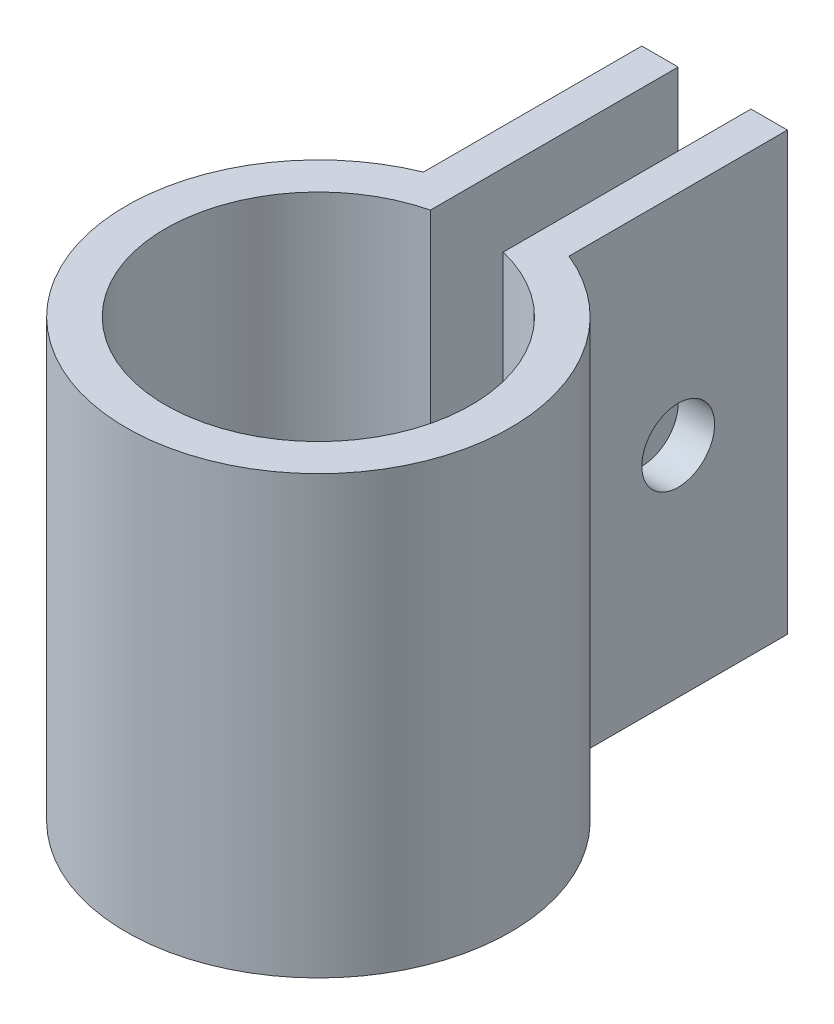
ISO-10303-21;
HEADER;
FILE_DESCRIPTION(('STEP AP214'),'2;1');
FILE_NAME('part.step','',(''),(''),'','','');
FILE_SCHEMA(('AUTOMOTIVE_DESIGN { 1 0 10303 214 1 1 1 1 }'));
ENDSEC;
DATA;
#1=APPLICATION_CONTEXT('core data for automotive mechanical design processes');
#2=APPLICATION_PROTOCOL_DEFINITION('international standard','automotive_design',2000,#1);
#3=PRODUCT_CONTEXT('',#1,'mechanical');
#4=PRODUCT('Part','Part','',(#3));
#5=PRODUCT_RELATED_PRODUCT_CATEGORY('part','',(#4));
#6=PRODUCT_DEFINITION_FORMATION('','',#4);
#7=PRODUCT_DEFINITION_CONTEXT('part definition',#1,'design');
#8=PRODUCT_DEFINITION('design','',#6,#7);
#9=PRODUCT_DEFINITION_SHAPE('','',#8);
#10=(LENGTH_UNIT() NAMED_UNIT(*) SI_UNIT(.MILLI.,.METRE.));
#11=(NAMED_UNIT(*) PLANE_ANGLE_UNIT() SI_UNIT($,.RADIAN.));
#12=(NAMED_UNIT(*) SI_UNIT($,.STERADIAN.) SOLID_ANGLE_UNIT());
#13=UNCERTAINTY_MEASURE_WITH_UNIT(LENGTH_MEASURE(1.E-05),#10,'distance_accuracy_value','');
#14=(GEOMETRIC_REPRESENTATION_CONTEXT(3) GLOBAL_UNCERTAINTY_ASSIGNED_CONTEXT((#13)) GLOBAL_UNIT_ASSIGNED_CONTEXT((#10,
#11,#12)) REPRESENTATION_CONTEXT('',''));
#15=CARTESIAN_POINT('',(0.,0.,0.));
#16=DIRECTION('',(0.,0.,1.));
#17=DIRECTION('',(1.,0.,0.));
#18=AXIS2_PLACEMENT_3D('',#15,#16,#17);
#19=CARTESIAN_POINT('',(0.,38.1,0.));
#20=DIRECTION('',(0.,-1.,0.));
#21=DIRECTION('',(0.,0.,-1.));
#22=AXIS2_PLACEMENT_3D('',#19,#20,#21);
#23=CYLINDRICAL_SURFACE('',#22,16.764);
#24=DIRECTION('',(0.,1.,0.));
#25=VECTOR('',#24,1.);
#26=CARTESIAN_POINT('',(6.35,-19.3127710336968,-15.5148057029407));
#27=LINE('',#26,#25);
#28=CARTESIAN_POINT('',(6.35,0.,-15.5148057029407));
#29=VERTEX_POINT('',#28);
#30=CARTESIAN_POINT('',(6.35,38.1,-15.5148057029407));
#31=VERTEX_POINT('',#30);
#32=EDGE_CURVE('E50',#29,#31,#27,.T.);
#33=ORIENTED_EDGE('',*,*,#32,.T.);
#34=CARTESIAN_POINT('',(0.,38.1,0.));
#35=DIRECTION('',(0.,1.,0.));
#36=DIRECTION('',(0.,0.,1.));
#37=AXIS2_PLACEMENT_3D('',#34,#35,#36);
#38=CIRCLE('',#37,16.764);
#39=CARTESIAN_POINT('',(-6.35,38.1,-15.5148057029407));
#40=VERTEX_POINT('',#39);
#41=EDGE_CURVE('E11',#40,#31,#38,.T.);
#42=ORIENTED_EDGE('',*,*,#41,.F.);
#43=DIRECTION('',(0.,1.,0.));
#44=VECTOR('',#43,1.);
#45=CARTESIAN_POINT('',(-6.35,-19.3127710336968,-15.5148057029407));
#46=LINE('',#45,#44);
#47=CARTESIAN_POINT('',(-6.35,0.,-15.5148057029407));
#48=VERTEX_POINT('',#47);
#49=EDGE_CURVE('E143',#48,#40,#46,.T.);
#50=ORIENTED_EDGE('',*,*,#49,.F.);
#51=CARTESIAN_POINT('',(0.,0.,0.));
#52=DIRECTION('',(0.,1.,0.));
#53=DIRECTION('',(0.,0.,1.));
#54=AXIS2_PLACEMENT_3D('',#51,#52,#53);
#55=CIRCLE('',#54,16.764);
#56=EDGE_CURVE('E35',#48,#29,#55,.T.);
#57=ORIENTED_EDGE('',*,*,#56,.T.);
#58=EDGE_LOOP('',(#33,#42,#50,#57));
#59=FACE_BOUND('',#58,.T.);
#60=ADVANCED_FACE('F32',(#59),#23,.T.);
#61=CARTESIAN_POINT('',(0.,38.1,0.));
#62=DIRECTION('',(0.,1.,0.));
#63=DIRECTION('',(0.,0.,1.));
#64=AXIS2_PLACEMENT_3D('',#61,#62,#63);
#65=PLANE('',#64);
#66=DIRECTION('',(1.,0.,0.));
#67=VECTOR('',#66,1.);
#68=CARTESIAN_POINT('',(6.35,38.1,-34.5648057029407));
#69=LINE('',#68,#67);
#70=CARTESIAN_POINT('',(3.175,38.1,-34.5648057029407));
#71=VERTEX_POINT('',#70);
#72=CARTESIAN_POINT('',(6.35,38.1,-34.5648057029407));
#73=VERTEX_POINT('',#72);
#74=EDGE_CURVE('E103',#71,#73,#69,.T.);
#75=ORIENTED_EDGE('',*,*,#74,.F.);
#76=DIRECTION('',(0.,0.,-1.));
#77=VECTOR('',#76,1.);
#78=CARTESIAN_POINT('',(3.175,38.1,-12.9515095645257));
#79=LINE('',#78,#77);
#80=CARTESIAN_POINT('',(3.175,38.1,-12.9515095645257));
#81=VERTEX_POINT('',#80);
#82=EDGE_CURVE('E153',#81,#71,#79,.T.);
#83=ORIENTED_EDGE('',*,*,#82,.F.);
#84=CARTESIAN_POINT('',(0.,38.1,0.));
#85=DIRECTION('',(0.,1.,0.));
#86=DIRECTION('',(0.,0.,1.));
#87=AXIS2_PLACEMENT_3D('',#84,#85,#86);
#88=CIRCLE('',#87,13.335);
#89=CARTESIAN_POINT('',(-3.17500000000001,38.1,-12.9515095645257));
#90=VERTEX_POINT('',#89);
#91=EDGE_CURVE('E163',#90,#81,#88,.T.);
#92=ORIENTED_EDGE('',*,*,#91,.F.);
#93=DIRECTION('',(0.,0.,1.));
#94=VECTOR('',#93,1.);
#95=CARTESIAN_POINT('',(-3.175,38.1,-12.9515095645257));
#96=LINE('',#95,#94);
#97=CARTESIAN_POINT('',(-3.175,38.1,-34.5648057029407));
#98=VERTEX_POINT('',#97);
#99=EDGE_CURVE('E138',#98,#90,#96,.T.);
#100=ORIENTED_EDGE('',*,*,#99,.F.);
#101=DIRECTION('',(-1.,0.,0.));
#102=VECTOR('',#101,1.);
#103=CARTESIAN_POINT('',(-6.35,38.1,-34.5648057029407));
#104=LINE('',#103,#102);
#105=CARTESIAN_POINT('',(-6.35,38.1,-34.5648057029407));
#106=VERTEX_POINT('',#105);
#107=EDGE_CURVE('E140',#98,#106,#104,.T.);
#108=ORIENTED_EDGE('',*,*,#107,.T.);
#109=DIRECTION('',(0.,0.,1.));
#110=VECTOR('',#109,1.);
#111=CARTESIAN_POINT('',(-6.35,38.1,-15.5148057029407));
#112=LINE('',#111,#110);
#113=EDGE_CURVE('E131',#106,#40,#112,.T.);
#114=ORIENTED_EDGE('',*,*,#113,.T.);
#115=ORIENTED_EDGE('',*,*,#41,.T.);
#116=DIRECTION('',(0.,0.,1.));
#117=VECTOR('',#116,1.);
#118=CARTESIAN_POINT('',(6.35,38.1,-15.5148057029407));
#119=LINE('',#118,#117);
#120=EDGE_CURVE('E98',#73,#31,#119,.T.);
#121=ORIENTED_EDGE('',*,*,#120,.F.);
#122=EDGE_LOOP('',(#75,#83,#92,#100,#108,#114,#115,#121));
#123=FACE_BOUND('',#122,.T.);
#124=ADVANCED_FACE('F112',(#123),#65,.T.);
#125=CARTESIAN_POINT('',(0.,0.,0.));
#126=DIRECTION('',(0.,1.,0.));
#127=DIRECTION('',(0.,0.,1.));
#128=AXIS2_PLACEMENT_3D('',#125,#126,#127);
#129=PLANE('',#128);
#130=DIRECTION('',(0.,0.,-1.));
#131=VECTOR('',#130,1.);
#132=CARTESIAN_POINT('',(3.175,0.,-12.9515095645257));
#133=LINE('',#132,#131);
#134=CARTESIAN_POINT('',(3.175,0.,-12.9515095645257));
#135=VERTEX_POINT('',#134);
#136=CARTESIAN_POINT('',(3.175,0.,-34.5648057029407));
#137=VERTEX_POINT('',#136);
#138=EDGE_CURVE('E152',#135,#137,#133,.T.);
#139=ORIENTED_EDGE('',*,*,#138,.T.);
#140=DIRECTION('',(-1.,0.,0.));
#141=VECTOR('',#140,1.);
#142=CARTESIAN_POINT('',(6.35,0.,-34.5648057029407));
#143=LINE('',#142,#141);
#144=CARTESIAN_POINT('',(6.35,0.,-34.5648057029407));
#145=VERTEX_POINT('',#144);
#146=EDGE_CURVE('E122',#145,#137,#143,.T.);
#147=ORIENTED_EDGE('',*,*,#146,.F.);
#148=DIRECTION('',(0.,0.,-1.));
#149=VECTOR('',#148,1.);
#150=CARTESIAN_POINT('',(6.35,0.,-15.5148057029407));
#151=LINE('',#150,#149);
#152=EDGE_CURVE('E99',#29,#145,#151,.T.);
#153=ORIENTED_EDGE('',*,*,#152,.F.);
#154=ORIENTED_EDGE('',*,*,#56,.F.);
#155=DIRECTION('',(0.,0.,-1.));
#156=VECTOR('',#155,1.);
#157=CARTESIAN_POINT('',(-6.35,0.,-15.5148057029407));
#158=LINE('',#157,#156);
#159=CARTESIAN_POINT('',(-6.35,0.,-34.5648057029407));
#160=VERTEX_POINT('',#159);
#161=EDGE_CURVE('E135',#48,#160,#158,.T.);
#162=ORIENTED_EDGE('',*,*,#161,.T.);
#163=DIRECTION('',(1.,0.,0.));
#164=VECTOR('',#163,1.);
#165=CARTESIAN_POINT('',(-6.35,0.,-34.5648057029407));
#166=LINE('',#165,#164);
#167=CARTESIAN_POINT('',(-3.175,0.,-34.5648057029407));
#168=VERTEX_POINT('',#167);
#169=EDGE_CURVE('E132',#160,#168,#166,.T.);
#170=ORIENTED_EDGE('',*,*,#169,.T.);
#171=DIRECTION('',(0.,0.,1.));
#172=VECTOR('',#171,1.);
#173=CARTESIAN_POINT('',(-3.175,0.,-12.9515095645257));
#174=LINE('',#173,#172);
#175=CARTESIAN_POINT('',(-3.175,0.,-12.9515095645257));
#176=VERTEX_POINT('',#175);
#177=EDGE_CURVE('E150',#168,#176,#174,.T.);
#178=ORIENTED_EDGE('',*,*,#177,.T.);
#179=CARTESIAN_POINT('',(0.,0.,0.));
#180=DIRECTION('',(0.,1.,0.));
#181=DIRECTION('',(0.,0.,1.));
#182=AXIS2_PLACEMENT_3D('',#179,#180,#181);
#183=CIRCLE('',#182,13.335);
#184=EDGE_CURVE('E160',#176,#135,#183,.T.);
#185=ORIENTED_EDGE('',*,*,#184,.T.);
#186=EDGE_LOOP('',(#139,#147,#153,#154,#162,#170,#178,#185));
#187=FACE_BOUND('',#186,.T.);
#188=ADVANCED_FACE('F169',(#187),#129,.F.);
#189=CARTESIAN_POINT('',(0.,38.1,0.));
#190=DIRECTION('',(0.,-1.,0.));
#191=DIRECTION('',(0.,0.,-1.));
#192=AXIS2_PLACEMENT_3D('',#189,#190,#191);
#193=CYLINDRICAL_SURFACE('',#192,13.335);
#194=DIRECTION('',(0.,1.,0.));
#195=VECTOR('',#194,1.);
#196=CARTESIAN_POINT('',(-3.175,0.,-12.9515095645257));
#197=LINE('',#196,#195);
#198=EDGE_CURVE('E155',#176,#90,#197,.T.);
#199=ORIENTED_EDGE('',*,*,#198,.T.);
#200=ORIENTED_EDGE('',*,*,#91,.T.);
#201=DIRECTION('',(0.,1.,0.));
#202=VECTOR('',#201,1.);
#203=CARTESIAN_POINT('',(3.175,0.,-12.9515095645257));
#204=LINE('',#203,#202);
#205=EDGE_CURVE('E158',#135,#81,#204,.T.);
#206=ORIENTED_EDGE('',*,*,#205,.F.);
#207=ORIENTED_EDGE('',*,*,#184,.F.);
#208=EDGE_LOOP('',(#199,#200,#206,#207));
#209=FACE_BOUND('',#208,.T.);
#210=ADVANCED_FACE('F173',(#209),#193,.F.);
#211=CARTESIAN_POINT('',(3.175,0.,-12.9515095645257));
#212=DIRECTION('',(1.,0.,0.));
#213=DIRECTION('',(0.,0.,-1.));
#214=AXIS2_PLACEMENT_3D('',#211,#212,#213);
#215=PLANE('',#214);
#216=CARTESIAN_POINT('',(3.175,19.05,-25.0398057029407));
#217=DIRECTION('',(1.,0.,0.));
#218=DIRECTION('',(0.,0.,-1.));
#219=AXIS2_PLACEMENT_3D('',#216,#217,#218);
#220=CIRCLE('',#219,3.175);
#221=CARTESIAN_POINT('',(3.175,19.05,-28.2148057029407));
#222=VERTEX_POINT('',#221);
#223=EDGE_CURVE('E114',#222,#222,#220,.F.);
#224=ORIENTED_EDGE('',*,*,#223,.F.);
#225=EDGE_LOOP('',(#224));
#226=FACE_BOUND('',#225,.T.);
#227=DIRECTION('',(0.,1.,0.));
#228=VECTOR('',#227,1.);
#229=CARTESIAN_POINT('',(3.175,-19.3127710336968,-34.5648057029407));
#230=LINE('',#229,#228);
#231=EDGE_CURVE('E102',#137,#71,#230,.T.);
#232=ORIENTED_EDGE('',*,*,#231,.F.);
#233=ORIENTED_EDGE('',*,*,#138,.F.);
#234=ORIENTED_EDGE('',*,*,#205,.T.);
#235=ORIENTED_EDGE('',*,*,#82,.T.);
#236=EDGE_LOOP('',(#232,#233,#234,#235));
#237=FACE_BOUND('',#236,.T.);
#238=ADVANCED_FACE('F176',(#226,#237),#215,.F.);
#239=CARTESIAN_POINT('',(-3.175,0.,-12.9515095645257));
#240=DIRECTION('',(-1.,0.,0.));
#241=DIRECTION('',(0.,0.,1.));
#242=AXIS2_PLACEMENT_3D('',#239,#240,#241);
#243=PLANE('',#242);
#244=CARTESIAN_POINT('',(-3.175,19.05,-25.0398057029407));
#245=DIRECTION('',(-1.,0.,0.));
#246=DIRECTION('',(0.,0.,1.));
#247=AXIS2_PLACEMENT_3D('',#244,#245,#246);
#248=CIRCLE('',#247,3.175);
#249=CARTESIAN_POINT('',(-3.175,19.05,-21.8648057029407));
#250=VERTEX_POINT('',#249);
#251=EDGE_CURVE('E128',#250,#250,#248,.T.);
#252=ORIENTED_EDGE('',*,*,#251,.T.);
#253=EDGE_LOOP('',(#252));
#254=FACE_BOUND('',#253,.T.);
#255=ORIENTED_EDGE('',*,*,#198,.F.);
#256=ORIENTED_EDGE('',*,*,#177,.F.);
#257=DIRECTION('',(0.,1.,0.));
#258=VECTOR('',#257,1.);
#259=CARTESIAN_POINT('',(-3.175,-19.3127710336968,-34.5648057029407));
#260=LINE('',#259,#258);
#261=EDGE_CURVE('E145',#168,#98,#260,.T.);
#262=ORIENTED_EDGE('',*,*,#261,.T.);
#263=ORIENTED_EDGE('',*,*,#99,.T.);
#264=EDGE_LOOP('',(#255,#256,#262,#263));
#265=FACE_BOUND('',#264,.T.);
#266=ADVANCED_FACE('F180',(#254,#265),#243,.F.);
#267=CARTESIAN_POINT('',(-6.35,-19.3127710336968,-15.5148057029407));
#268=DIRECTION('',(-1.,0.,0.));
#269=DIRECTION('',(0.,0.,1.));
#270=AXIS2_PLACEMENT_3D('',#267,#268,#269);
#271=PLANE('',#270);
#272=CARTESIAN_POINT('',(-6.35,19.05,-25.0398057029407));
#273=DIRECTION('',(-1.,0.,0.));
#274=DIRECTION('',(0.,0.,1.));
#275=AXIS2_PLACEMENT_3D('',#272,#273,#274);
#276=CIRCLE('',#275,3.175);
#277=CARTESIAN_POINT('',(-6.35,19.05,-21.8648057029407));
#278=VERTEX_POINT('',#277);
#279=EDGE_CURVE('E125',#278,#278,#276,.T.);
#280=ORIENTED_EDGE('',*,*,#279,.F.);
#281=EDGE_LOOP('',(#280));
#282=FACE_BOUND('',#281,.T.);
#283=ORIENTED_EDGE('',*,*,#161,.F.);
#284=ORIENTED_EDGE('',*,*,#49,.T.);
#285=ORIENTED_EDGE('',*,*,#113,.F.);
#286=DIRECTION('',(0.,1.,0.));
#287=VECTOR('',#286,1.);
#288=CARTESIAN_POINT('',(-6.35,-19.3127710336968,-34.5648057029407));
#289=LINE('',#288,#287);
#290=EDGE_CURVE('E136',#160,#106,#289,.T.);
#291=ORIENTED_EDGE('',*,*,#290,.F.);
#292=EDGE_LOOP('',(#283,#284,#285,#291));
#293=FACE_BOUND('',#292,.T.);
#294=ADVANCED_FACE('F188',(#282,#293),#271,.T.);
#295=CARTESIAN_POINT('',(-6.35,-19.3127710336968,-34.5648057029407));
#296=DIRECTION('',(0.,0.,-1.));
#297=DIRECTION('',(-1.,0.,0.));
#298=AXIS2_PLACEMENT_3D('',#295,#296,#297);
#299=PLANE('',#298);
#300=ORIENTED_EDGE('',*,*,#169,.F.);
#301=ORIENTED_EDGE('',*,*,#290,.T.);
#302=ORIENTED_EDGE('',*,*,#107,.F.);
#303=ORIENTED_EDGE('',*,*,#261,.F.);
#304=EDGE_LOOP('',(#300,#301,#302,#303));
#305=FACE_BOUND('',#304,.T.);
#306=ADVANCED_FACE('F183',(#305),#299,.T.);
#307=CARTESIAN_POINT('',(16.764,19.05,-25.0398057029407));
#308=DIRECTION('',(-1.,0.,0.));
#309=DIRECTION('',(0.,0.,1.));
#310=AXIS2_PLACEMENT_3D('',#307,#308,#309);
#311=CYLINDRICAL_SURFACE('',#310,3.175);
#312=ORIENTED_EDGE('',*,*,#279,.T.);
#313=EDGE_LOOP('',(#312));
#314=FACE_BOUND('',#313,.T.);
#315=ORIENTED_EDGE('',*,*,#251,.F.);
#316=EDGE_LOOP('',(#315));
#317=FACE_BOUND('',#316,.T.);
#318=ADVANCED_FACE('F211',(#314,#317),#311,.F.);
#319=CARTESIAN_POINT('',(6.35,-19.3127710336968,-34.5648057029407));
#320=DIRECTION('',(0.,0.,1.));
#321=DIRECTION('',(1.,0.,0.));
#322=AXIS2_PLACEMENT_3D('',#319,#320,#321);
#323=PLANE('',#322);
#324=DIRECTION('',(0.,1.,0.));
#325=VECTOR('',#324,1.);
#326=CARTESIAN_POINT('',(6.35,-19.3127710336968,-34.5648057029407));
#327=LINE('',#326,#325);
#328=EDGE_CURVE('E94',#145,#73,#327,.T.);
#329=ORIENTED_EDGE('',*,*,#328,.F.);
#330=ORIENTED_EDGE('',*,*,#146,.T.);
#331=ORIENTED_EDGE('',*,*,#231,.T.);
#332=ORIENTED_EDGE('',*,*,#74,.T.);
#333=EDGE_LOOP('',(#329,#330,#331,#332));
#334=FACE_BOUND('',#333,.T.);
#335=ADVANCED_FACE('F107',(#334),#323,.F.);
#336=CARTESIAN_POINT('',(6.35,-19.3127710336968,-15.5148057029407));
#337=DIRECTION('',(-1.,0.,0.));
#338=DIRECTION('',(0.,0.,1.));
#339=AXIS2_PLACEMENT_3D('',#336,#337,#338);
#340=PLANE('',#339);
#341=CARTESIAN_POINT('',(6.35,19.05,-25.0398057029407));
#342=DIRECTION('',(-1.,0.,0.));
#343=DIRECTION('',(0.,0.,1.));
#344=AXIS2_PLACEMENT_3D('',#341,#342,#343);
#345=CIRCLE('',#344,3.175);
#346=CARTESIAN_POINT('',(6.35,19.05,-21.8648057029407));
#347=VERTEX_POINT('',#346);
#348=EDGE_CURVE('E117',#347,#347,#345,.T.);
#349=ORIENTED_EDGE('',*,*,#348,.T.);
#350=EDGE_LOOP('',(#349));
#351=FACE_BOUND('',#350,.T.);
#352=ORIENTED_EDGE('',*,*,#32,.F.);
#353=ORIENTED_EDGE('',*,*,#152,.T.);
#354=ORIENTED_EDGE('',*,*,#328,.T.);
#355=ORIENTED_EDGE('',*,*,#120,.T.);
#356=EDGE_LOOP('',(#352,#353,#354,#355));
#357=FACE_BOUND('',#356,.T.);
#358=ADVANCED_FACE('F96',(#351,#357),#340,.F.);
#359=CARTESIAN_POINT('',(-16.764,19.05,-25.0398057029407));
#360=DIRECTION('',(1.,0.,0.));
#361=DIRECTION('',(0.,0.,-1.));
#362=AXIS2_PLACEMENT_3D('',#359,#360,#361);
#363=CYLINDRICAL_SURFACE('',#362,3.175);
#364=ORIENTED_EDGE('',*,*,#348,.F.);
#365=EDGE_LOOP('',(#364));
#366=FACE_BOUND('',#365,.T.);
#367=ORIENTED_EDGE('',*,*,#223,.T.);
#368=EDGE_LOOP('',(#367));
#369=FACE_BOUND('',#368,.T.);
#370=ADVANCED_FACE('F217',(#366,#369),#363,.F.);
#371=CLOSED_SHELL('',(#60,#124,#188,#210,#238,#266,#294,#306,#318,#335,#358,#370));
#372=MANIFOLD_SOLID_BREP('B2',#371);
#373=ADVANCED_BREP_SHAPE_REPRESENTATION('',(#18,#372),#14);
#374=SHAPE_DEFINITION_REPRESENTATION(#9,#373);
ENDSEC;
END-ISO-10303-21;
